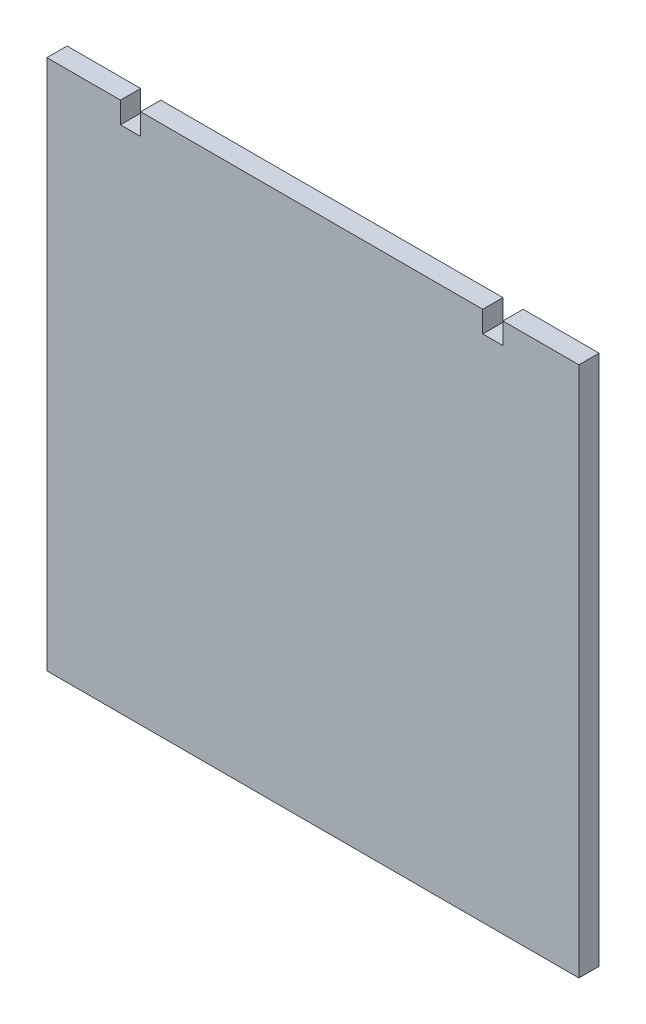
ISO-10303-21;
HEADER;
FILE_DESCRIPTION(('STEP AP214'),'2;1');
FILE_NAME('part.step','',(''),(''),'','','');
FILE_SCHEMA(('AUTOMOTIVE_DESIGN { 1 0 10303 214 1 1 1 1 }'));
ENDSEC;
DATA;
#1=APPLICATION_CONTEXT('core data for automotive mechanical design processes');
#2=APPLICATION_PROTOCOL_DEFINITION('international standard','automotive_design',2000,#1);
#3=PRODUCT_CONTEXT('',#1,'mechanical');
#4=PRODUCT('Part','Part','',(#3));
#5=PRODUCT_RELATED_PRODUCT_CATEGORY('part','',(#4));
#6=PRODUCT_DEFINITION_FORMATION('','',#4);
#7=PRODUCT_DEFINITION_CONTEXT('part definition',#1,'design');
#8=PRODUCT_DEFINITION('design','',#6,#7);
#9=PRODUCT_DEFINITION_SHAPE('','',#8);
#10=(LENGTH_UNIT() NAMED_UNIT(*) SI_UNIT(.MILLI.,.METRE.));
#11=(NAMED_UNIT(*) PLANE_ANGLE_UNIT() SI_UNIT($,.RADIAN.));
#12=(NAMED_UNIT(*) SI_UNIT($,.STERADIAN.) SOLID_ANGLE_UNIT());
#13=UNCERTAINTY_MEASURE_WITH_UNIT(LENGTH_MEASURE(1.E-05),#10,'distance_accuracy_value','');
#14=(GEOMETRIC_REPRESENTATION_CONTEXT(3) GLOBAL_UNCERTAINTY_ASSIGNED_CONTEXT((#13)) GLOBAL_UNIT_ASSIGNED_CONTEXT((#10,
#11,#12)) REPRESENTATION_CONTEXT('',''));
#15=CARTESIAN_POINT('',(0.,0.,0.));
#16=DIRECTION('',(0.,0.,1.));
#17=DIRECTION('',(1.,0.,0.));
#18=AXIS2_PLACEMENT_3D('',#15,#16,#17);
#19=CARTESIAN_POINT('',(0.,0.,2.9972));
#20=DIRECTION('',(1.,0.,0.));
#21=DIRECTION('',(0.,0.,-1.));
#22=AXIS2_PLACEMENT_3D('',#19,#20,#21);
#23=PLANE('',#22);
#24=DIRECTION('',(0.,-1.,0.));
#25=VECTOR('',#24,1.);
#26=CARTESIAN_POINT('',(0.,0.,0.));
#27=LINE('',#26,#25);
#28=CARTESIAN_POINT('',(0.,78.867,0.));
#29=VERTEX_POINT('',#28);
#30=CARTESIAN_POINT('',(0.,0.,0.));
#31=VERTEX_POINT('',#30);
#32=EDGE_CURVE('E155',#29,#31,#27,.T.);
#33=ORIENTED_EDGE('',*,*,#32,.T.);
#34=DIRECTION('',(0.,0.,-1.));
#35=VECTOR('',#34,1.);
#36=CARTESIAN_POINT('',(0.,0.,2.9972));
#37=LINE('',#36,#35);
#38=CARTESIAN_POINT('',(0.,0.,2.9972));
#39=VERTEX_POINT('',#38);
#40=EDGE_CURVE('E11',#39,#31,#37,.T.);
#41=ORIENTED_EDGE('',*,*,#40,.F.);
#42=DIRECTION('',(0.,-1.,0.));
#43=VECTOR('',#42,1.);
#44=CARTESIAN_POINT('',(0.,0.,2.9972));
#45=LINE('',#44,#43);
#46=CARTESIAN_POINT('',(0.,78.867,2.9972));
#47=VERTEX_POINT('',#46);
#48=EDGE_CURVE('E177',#47,#39,#45,.T.);
#49=ORIENTED_EDGE('',*,*,#48,.F.);
#50=DIRECTION('',(0.,0.,-1.));
#51=VECTOR('',#50,1.);
#52=CARTESIAN_POINT('',(0.,78.867,2.9972));
#53=LINE('',#52,#51);
#54=EDGE_CURVE('E151',#47,#29,#53,.T.);
#55=ORIENTED_EDGE('',*,*,#54,.T.);
#56=EDGE_LOOP('',(#33,#41,#49,#55));
#57=FACE_BOUND('',#56,.T.);
#58=ADVANCED_FACE('F35',(#57),#23,.F.);
#59=CARTESIAN_POINT('',(0.,0.,2.9972));
#60=DIRECTION('',(0.,1.,0.));
#61=DIRECTION('',(0.,0.,1.));
#62=AXIS2_PLACEMENT_3D('',#59,#60,#61);
#63=PLANE('',#62);
#64=DIRECTION('',(1.,0.,0.));
#65=VECTOR('',#64,1.);
#66=CARTESIAN_POINT('',(0.,0.,0.));
#67=LINE('',#66,#65);
#68=CARTESIAN_POINT('',(79.,0.,0.));
#69=VERTEX_POINT('',#68);
#70=EDGE_CURVE('E158',#31,#69,#67,.T.);
#71=ORIENTED_EDGE('',*,*,#70,.T.);
#72=DIRECTION('',(0.,0.,-1.));
#73=VECTOR('',#72,1.);
#74=CARTESIAN_POINT('',(79.,0.,2.9972));
#75=LINE('',#74,#73);
#76=CARTESIAN_POINT('',(79.,0.,2.9972));
#77=VERTEX_POINT('',#76);
#78=EDGE_CURVE('E43',#77,#69,#75,.T.);
#79=ORIENTED_EDGE('',*,*,#78,.F.);
#80=DIRECTION('',(1.,0.,0.));
#81=VECTOR('',#80,1.);
#82=CARTESIAN_POINT('',(0.,0.,2.9972));
#83=LINE('',#82,#81);
#84=EDGE_CURVE('E106',#39,#77,#83,.T.);
#85=ORIENTED_EDGE('',*,*,#84,.F.);
#86=ORIENTED_EDGE('',*,*,#40,.T.);
#87=EDGE_LOOP('',(#71,#79,#85,#86));
#88=FACE_BOUND('',#87,.T.);
#89=ADVANCED_FACE('F255',(#88),#63,.F.);
#90=CARTESIAN_POINT('',(79.,0.,2.9972));
#91=DIRECTION('',(-1.,0.,0.));
#92=DIRECTION('',(0.,0.,1.));
#93=AXIS2_PLACEMENT_3D('',#90,#91,#92);
#94=PLANE('',#93);
#95=DIRECTION('',(0.,1.,0.));
#96=VECTOR('',#95,1.);
#97=CARTESIAN_POINT('',(79.,0.,0.));
#98=LINE('',#97,#96);
#99=CARTESIAN_POINT('',(79.,78.867,0.));
#100=VERTEX_POINT('',#99);
#101=EDGE_CURVE('E160',#69,#100,#98,.T.);
#102=ORIENTED_EDGE('',*,*,#101,.T.);
#103=DIRECTION('',(0.,0.,-1.));
#104=VECTOR('',#103,1.);
#105=CARTESIAN_POINT('',(79.,78.867,2.9972));
#106=LINE('',#105,#104);
#107=CARTESIAN_POINT('',(79.,78.867,2.9972));
#108=VERTEX_POINT('',#107);
#109=EDGE_CURVE('E196',#108,#100,#106,.T.);
#110=ORIENTED_EDGE('',*,*,#109,.F.);
#111=DIRECTION('',(0.,1.,0.));
#112=VECTOR('',#111,1.);
#113=CARTESIAN_POINT('',(79.,0.,2.9972));
#114=LINE('',#113,#112);
#115=EDGE_CURVE('E204',#77,#108,#114,.T.);
#116=ORIENTED_EDGE('',*,*,#115,.F.);
#117=ORIENTED_EDGE('',*,*,#78,.T.);
#118=EDGE_LOOP('',(#102,#110,#116,#117));
#119=FACE_BOUND('',#118,.T.);
#120=ADVANCED_FACE('F202',(#119),#94,.F.);
#121=CARTESIAN_POINT('',(67.7194,78.867,2.9972));
#122=DIRECTION('',(0.,-1.,0.));
#123=DIRECTION('',(1.,0.,0.));
#124=AXIS2_PLACEMENT_3D('',#121,#122,#123);
#125=PLANE('',#124);
#126=DIRECTION('',(-1.,0.,0.));
#127=VECTOR('',#126,1.);
#128=CARTESIAN_POINT('',(67.7194,78.867,0.));
#129=LINE('',#128,#127);
#130=CARTESIAN_POINT('',(67.7194,78.867,0.));
#131=VERTEX_POINT('',#130);
#132=EDGE_CURVE('E162',#100,#131,#129,.T.);
#133=ORIENTED_EDGE('',*,*,#132,.T.);
#134=DIRECTION('',(0.,0.,-1.));
#135=VECTOR('',#134,1.);
#136=CARTESIAN_POINT('',(67.7194,78.867,2.9972));
#137=LINE('',#136,#135);
#138=CARTESIAN_POINT('',(67.7194,78.867,2.9972));
#139=VERTEX_POINT('',#138);
#140=EDGE_CURVE('E193',#139,#131,#137,.T.);
#141=ORIENTED_EDGE('',*,*,#140,.F.);
#142=DIRECTION('',(-1.,0.,0.));
#143=VECTOR('',#142,1.);
#144=CARTESIAN_POINT('',(67.7194,78.867,2.9972));
#145=LINE('',#144,#143);
#146=EDGE_CURVE('E222',#108,#139,#145,.T.);
#147=ORIENTED_EDGE('',*,*,#146,.F.);
#148=ORIENTED_EDGE('',*,*,#109,.T.);
#149=EDGE_LOOP('',(#133,#141,#147,#148));
#150=FACE_BOUND('',#149,.T.);
#151=ADVANCED_FACE('F213',(#150),#125,.F.);
#152=CARTESIAN_POINT('',(67.7194,78.867,2.9972));
#153=DIRECTION('',(1.,0.,0.));
#154=DIRECTION('',(0.,0.,-1.));
#155=AXIS2_PLACEMENT_3D('',#152,#153,#154);
#156=PLANE('',#155);
#157=DIRECTION('',(0.,-1.,0.));
#158=VECTOR('',#157,1.);
#159=CARTESIAN_POINT('',(67.7194,78.867,0.));
#160=LINE('',#159,#158);
#161=CARTESIAN_POINT('',(67.7194,75.692,0.));
#162=VERTEX_POINT('',#161);
#163=EDGE_CURVE('E164',#131,#162,#160,.T.);
#164=ORIENTED_EDGE('',*,*,#163,.T.);
#165=DIRECTION('',(0.,0.,-1.));
#166=VECTOR('',#165,1.);
#167=CARTESIAN_POINT('',(67.7194,75.692,2.9972));
#168=LINE('',#167,#166);
#169=CARTESIAN_POINT('',(67.7194,75.692,2.9972));
#170=VERTEX_POINT('',#169);
#171=EDGE_CURVE('E190',#170,#162,#168,.T.);
#172=ORIENTED_EDGE('',*,*,#171,.F.);
#173=DIRECTION('',(0.,-1.,0.));
#174=VECTOR('',#173,1.);
#175=CARTESIAN_POINT('',(67.7194,78.867,2.9972));
#176=LINE('',#175,#174);
#177=EDGE_CURVE('E219',#139,#170,#176,.T.);
#178=ORIENTED_EDGE('',*,*,#177,.F.);
#179=ORIENTED_EDGE('',*,*,#140,.T.);
#180=EDGE_LOOP('',(#164,#172,#178,#179));
#181=FACE_BOUND('',#180,.T.);
#182=ADVANCED_FACE('F217',(#181),#156,.F.);
#183=CARTESIAN_POINT('',(67.7194,75.692,2.9972));
#184=DIRECTION('',(0.,-1.,0.));
#185=DIRECTION('',(1.,0.,0.));
#186=AXIS2_PLACEMENT_3D('',#183,#184,#185);
#187=PLANE('',#186);
#188=DIRECTION('',(-1.,0.,0.));
#189=VECTOR('',#188,1.);
#190=CARTESIAN_POINT('',(67.7194,75.692,0.));
#191=LINE('',#190,#189);
#192=CARTESIAN_POINT('',(64.7222,75.692,0.));
#193=VERTEX_POINT('',#192);
#194=EDGE_CURVE('E166',#162,#193,#191,.T.);
#195=ORIENTED_EDGE('',*,*,#194,.T.);
#196=DIRECTION('',(0.,0.,-1.));
#197=VECTOR('',#196,1.);
#198=CARTESIAN_POINT('',(64.7222,75.692,2.9972));
#199=LINE('',#198,#197);
#200=CARTESIAN_POINT('',(64.7222,75.692,2.9972));
#201=VERTEX_POINT('',#200);
#202=EDGE_CURVE('E187',#201,#193,#199,.T.);
#203=ORIENTED_EDGE('',*,*,#202,.F.);
#204=DIRECTION('',(-1.,0.,0.));
#205=VECTOR('',#204,1.);
#206=CARTESIAN_POINT('',(67.7194,75.692,2.9972));
#207=LINE('',#206,#205);
#208=EDGE_CURVE('E221',#170,#201,#207,.T.);
#209=ORIENTED_EDGE('',*,*,#208,.F.);
#210=ORIENTED_EDGE('',*,*,#171,.T.);
#211=EDGE_LOOP('',(#195,#203,#209,#210));
#212=FACE_BOUND('',#211,.T.);
#213=ADVANCED_FACE('F268',(#212),#187,.F.);
#214=CARTESIAN_POINT('',(64.7222,75.692,2.9972));
#215=DIRECTION('',(-1.,0.,0.));
#216=DIRECTION('',(0.,0.,1.));
#217=AXIS2_PLACEMENT_3D('',#214,#215,#216);
#218=PLANE('',#217);
#219=DIRECTION('',(0.,1.,0.));
#220=VECTOR('',#219,1.);
#221=CARTESIAN_POINT('',(64.7222,75.692,0.));
#222=LINE('',#221,#220);
#223=CARTESIAN_POINT('',(64.7222,78.867,0.));
#224=VERTEX_POINT('',#223);
#225=EDGE_CURVE('E168',#193,#224,#222,.T.);
#226=ORIENTED_EDGE('',*,*,#225,.T.);
#227=DIRECTION('',(0.,0.,-1.));
#228=VECTOR('',#227,1.);
#229=CARTESIAN_POINT('',(64.7222,78.867,2.9972));
#230=LINE('',#229,#228);
#231=CARTESIAN_POINT('',(64.7222,78.867,2.9972));
#232=VERTEX_POINT('',#231);
#233=EDGE_CURVE('E184',#232,#224,#230,.T.);
#234=ORIENTED_EDGE('',*,*,#233,.F.);
#235=DIRECTION('',(0.,1.,0.));
#236=VECTOR('',#235,1.);
#237=CARTESIAN_POINT('',(64.7222,75.692,2.9972));
#238=LINE('',#237,#236);
#239=EDGE_CURVE('E224',#201,#232,#238,.T.);
#240=ORIENTED_EDGE('',*,*,#239,.F.);
#241=ORIENTED_EDGE('',*,*,#202,.T.);
#242=EDGE_LOOP('',(#226,#234,#240,#241));
#243=FACE_BOUND('',#242,.T.);
#244=ADVANCED_FACE('F271',(#243),#218,.F.);
#245=CARTESIAN_POINT('',(13.9222,78.867,2.9972));
#246=DIRECTION('',(0.,-1.,0.));
#247=DIRECTION('',(0.,0.,-1.));
#248=AXIS2_PLACEMENT_3D('',#245,#246,#247);
#249=PLANE('',#248);
#250=DIRECTION('',(-1.,0.,0.));
#251=VECTOR('',#250,1.);
#252=CARTESIAN_POINT('',(13.9222,78.867,0.));
#253=LINE('',#252,#251);
#254=CARTESIAN_POINT('',(13.9222,78.867,0.));
#255=VERTEX_POINT('',#254);
#256=EDGE_CURVE('E170',#224,#255,#253,.T.);
#257=ORIENTED_EDGE('',*,*,#256,.T.);
#258=DIRECTION('',(0.,0.,-1.));
#259=VECTOR('',#258,1.);
#260=CARTESIAN_POINT('',(13.9222,78.867,2.9972));
#261=LINE('',#260,#259);
#262=CARTESIAN_POINT('',(13.9222,78.867,2.9972));
#263=VERTEX_POINT('',#262);
#264=EDGE_CURVE('E181',#263,#255,#261,.T.);
#265=ORIENTED_EDGE('',*,*,#264,.F.);
#266=DIRECTION('',(-1.,0.,0.));
#267=VECTOR('',#266,1.);
#268=CARTESIAN_POINT('',(13.9222,78.867,2.9972));
#269=LINE('',#268,#267);
#270=EDGE_CURVE('E230',#232,#263,#269,.T.);
#271=ORIENTED_EDGE('',*,*,#270,.F.);
#272=ORIENTED_EDGE('',*,*,#233,.T.);
#273=EDGE_LOOP('',(#257,#265,#271,#272));
#274=FACE_BOUND('',#273,.T.);
#275=ADVANCED_FACE('F236',(#274),#249,.F.);
#276=CARTESIAN_POINT('',(13.9222,75.692,2.9972));
#277=DIRECTION('',(1.,0.,0.));
#278=DIRECTION('',(0.,0.,-1.));
#279=AXIS2_PLACEMENT_3D('',#276,#277,#278);
#280=PLANE('',#279);
#281=DIRECTION('',(0.,-1.,0.));
#282=VECTOR('',#281,1.);
#283=CARTESIAN_POINT('',(13.9222,75.692,0.));
#284=LINE('',#283,#282);
#285=CARTESIAN_POINT('',(13.9222,75.692,0.));
#286=VERTEX_POINT('',#285);
#287=EDGE_CURVE('E172',#255,#286,#284,.T.);
#288=ORIENTED_EDGE('',*,*,#287,.T.);
#289=DIRECTION('',(0.,0.,-1.));
#290=VECTOR('',#289,1.);
#291=CARTESIAN_POINT('',(13.9222,75.692,2.9972));
#292=LINE('',#291,#290);
#293=CARTESIAN_POINT('',(13.9222,75.692,2.9972));
#294=VERTEX_POINT('',#293);
#295=EDGE_CURVE('E146',#294,#286,#292,.T.);
#296=ORIENTED_EDGE('',*,*,#295,.F.);
#297=DIRECTION('',(0.,-1.,0.));
#298=VECTOR('',#297,1.);
#299=CARTESIAN_POINT('',(13.9222,75.692,2.9972));
#300=LINE('',#299,#298);
#301=EDGE_CURVE('E137',#263,#294,#300,.T.);
#302=ORIENTED_EDGE('',*,*,#301,.F.);
#303=ORIENTED_EDGE('',*,*,#264,.T.);
#304=EDGE_LOOP('',(#288,#296,#302,#303));
#305=FACE_BOUND('',#304,.T.);
#306=ADVANCED_FACE('F240',(#305),#280,.F.);
#307=CARTESIAN_POINT('',(10.925,75.692,2.9972));
#308=DIRECTION('',(0.,-1.,0.));
#309=DIRECTION('',(0.,0.,-1.));
#310=AXIS2_PLACEMENT_3D('',#307,#308,#309);
#311=PLANE('',#310);
#312=DIRECTION('',(-1.,0.,0.));
#313=VECTOR('',#312,1.);
#314=CARTESIAN_POINT('',(10.925,75.692,0.));
#315=LINE('',#314,#313);
#316=CARTESIAN_POINT('',(10.925,75.692,0.));
#317=VERTEX_POINT('',#316);
#318=EDGE_CURVE('E145',#286,#317,#315,.T.);
#319=ORIENTED_EDGE('',*,*,#318,.T.);
#320=DIRECTION('',(0.,0.,-1.));
#321=VECTOR('',#320,1.);
#322=CARTESIAN_POINT('',(10.925,75.692,2.9972));
#323=LINE('',#322,#321);
#324=CARTESIAN_POINT('',(10.925,75.692,2.9972));
#325=VERTEX_POINT('',#324);
#326=EDGE_CURVE('E142',#325,#317,#323,.T.);
#327=ORIENTED_EDGE('',*,*,#326,.F.);
#328=DIRECTION('',(-1.,0.,0.));
#329=VECTOR('',#328,1.);
#330=CARTESIAN_POINT('',(10.925,75.692,2.9972));
#331=LINE('',#330,#329);
#332=EDGE_CURVE('E131',#294,#325,#331,.T.);
#333=ORIENTED_EDGE('',*,*,#332,.F.);
#334=ORIENTED_EDGE('',*,*,#295,.T.);
#335=EDGE_LOOP('',(#319,#327,#333,#334));
#336=FACE_BOUND('',#335,.T.);
#337=ADVANCED_FACE('F143',(#336),#311,.F.);
#338=CARTESIAN_POINT('',(10.925,78.867,2.9972));
#339=DIRECTION('',(-1.,0.,0.));
#340=DIRECTION('',(0.,0.,1.));
#341=AXIS2_PLACEMENT_3D('',#338,#339,#340);
#342=PLANE('',#341);
#343=DIRECTION('',(0.,1.,0.));
#344=VECTOR('',#343,1.);
#345=CARTESIAN_POINT('',(10.925,78.867,0.));
#346=LINE('',#345,#344);
#347=CARTESIAN_POINT('',(10.925,78.867,0.));
#348=VERTEX_POINT('',#347);
#349=EDGE_CURVE('E92',#317,#348,#346,.T.);
#350=ORIENTED_EDGE('',*,*,#349,.T.);
#351=DIRECTION('',(0.,0.,-1.));
#352=VECTOR('',#351,1.);
#353=CARTESIAN_POINT('',(10.925,78.867,2.9972));
#354=LINE('',#353,#352);
#355=CARTESIAN_POINT('',(10.925,78.867,2.9972));
#356=VERTEX_POINT('',#355);
#357=EDGE_CURVE('E147',#356,#348,#354,.T.);
#358=ORIENTED_EDGE('',*,*,#357,.F.);
#359=DIRECTION('',(0.,1.,0.));
#360=VECTOR('',#359,1.);
#361=CARTESIAN_POINT('',(10.925,78.867,2.9972));
#362=LINE('',#361,#360);
#363=EDGE_CURVE('E135',#325,#356,#362,.T.);
#364=ORIENTED_EDGE('',*,*,#363,.F.);
#365=ORIENTED_EDGE('',*,*,#326,.T.);
#366=EDGE_LOOP('',(#350,#358,#364,#365));
#367=FACE_BOUND('',#366,.T.);
#368=ADVANCED_FACE('F149',(#367),#342,.F.);
#369=CARTESIAN_POINT('',(0.,78.867,2.9972));
#370=DIRECTION('',(0.,-1.,0.));
#371=DIRECTION('',(0.,0.,-1.));
#372=AXIS2_PLACEMENT_3D('',#369,#370,#371);
#373=PLANE('',#372);
#374=DIRECTION('',(-1.,0.,0.));
#375=VECTOR('',#374,1.);
#376=CARTESIAN_POINT('',(0.,78.867,0.));
#377=LINE('',#376,#375);
#378=EDGE_CURVE('E98',#348,#29,#377,.T.);
#379=ORIENTED_EDGE('',*,*,#378,.T.);
#380=ORIENTED_EDGE('',*,*,#54,.F.);
#381=DIRECTION('',(-1.,0.,0.));
#382=VECTOR('',#381,1.);
#383=CARTESIAN_POINT('',(0.,78.867,2.9972));
#384=LINE('',#383,#382);
#385=EDGE_CURVE('E51',#356,#47,#384,.T.);
#386=ORIENTED_EDGE('',*,*,#385,.F.);
#387=ORIENTED_EDGE('',*,*,#357,.T.);
#388=EDGE_LOOP('',(#379,#380,#386,#387));
#389=FACE_BOUND('',#388,.T.);
#390=ADVANCED_FACE('F244',(#389),#373,.F.);
#391=CARTESIAN_POINT('',(0.,78.867,2.9972));
#392=DIRECTION('',(0.,0.,-1.));
#393=DIRECTION('',(-1.,0.,0.));
#394=AXIS2_PLACEMENT_3D('',#391,#392,#393);
#395=PLANE('',#394);
#396=ORIENTED_EDGE('',*,*,#48,.T.);
#397=ORIENTED_EDGE('',*,*,#84,.T.);
#398=ORIENTED_EDGE('',*,*,#115,.T.);
#399=ORIENTED_EDGE('',*,*,#146,.T.);
#400=ORIENTED_EDGE('',*,*,#177,.T.);
#401=ORIENTED_EDGE('',*,*,#208,.T.);
#402=ORIENTED_EDGE('',*,*,#239,.T.);
#403=ORIENTED_EDGE('',*,*,#270,.T.);
#404=ORIENTED_EDGE('',*,*,#301,.T.);
#405=ORIENTED_EDGE('',*,*,#332,.T.);
#406=ORIENTED_EDGE('',*,*,#363,.T.);
#407=ORIENTED_EDGE('',*,*,#385,.T.);
#408=EDGE_LOOP('',(#396,#397,#398,#399,#400,#401,#402,#403,#404,#405,#406,#407));
#409=FACE_BOUND('',#408,.T.);
#410=ADVANCED_FACE('F133',(#409),#395,.F.);
#411=CARTESIAN_POINT('',(0.,78.867,0.));
#412=DIRECTION('',(0.,0.,-1.));
#413=DIRECTION('',(-1.,0.,0.));
#414=AXIS2_PLACEMENT_3D('',#411,#412,#413);
#415=PLANE('',#414);
#416=ORIENTED_EDGE('',*,*,#32,.F.);
#417=ORIENTED_EDGE('',*,*,#378,.F.);
#418=ORIENTED_EDGE('',*,*,#349,.F.);
#419=ORIENTED_EDGE('',*,*,#318,.F.);
#420=ORIENTED_EDGE('',*,*,#287,.F.);
#421=ORIENTED_EDGE('',*,*,#256,.F.);
#422=ORIENTED_EDGE('',*,*,#225,.F.);
#423=ORIENTED_EDGE('',*,*,#194,.F.);
#424=ORIENTED_EDGE('',*,*,#163,.F.);
#425=ORIENTED_EDGE('',*,*,#132,.F.);
#426=ORIENTED_EDGE('',*,*,#101,.F.);
#427=ORIENTED_EDGE('',*,*,#70,.F.);
#428=EDGE_LOOP('',(#416,#417,#418,#419,#420,#421,#422,#423,#424,#425,#426,#427));
#429=FACE_BOUND('',#428,.T.);
#430=ADVANCED_FACE('F208',(#429),#415,.T.);
#431=CLOSED_SHELL('',(#58,#89,#120,#151,#182,#213,#244,#275,#306,#337,#368,#390,#410,#430));
#432=MANIFOLD_SOLID_BREP('B2',#431);
#433=ADVANCED_BREP_SHAPE_REPRESENTATION('',(#18,#432),#14);
#434=SHAPE_DEFINITION_REPRESENTATION(#9,#433);
ENDSEC;
END-ISO-10303-21;
